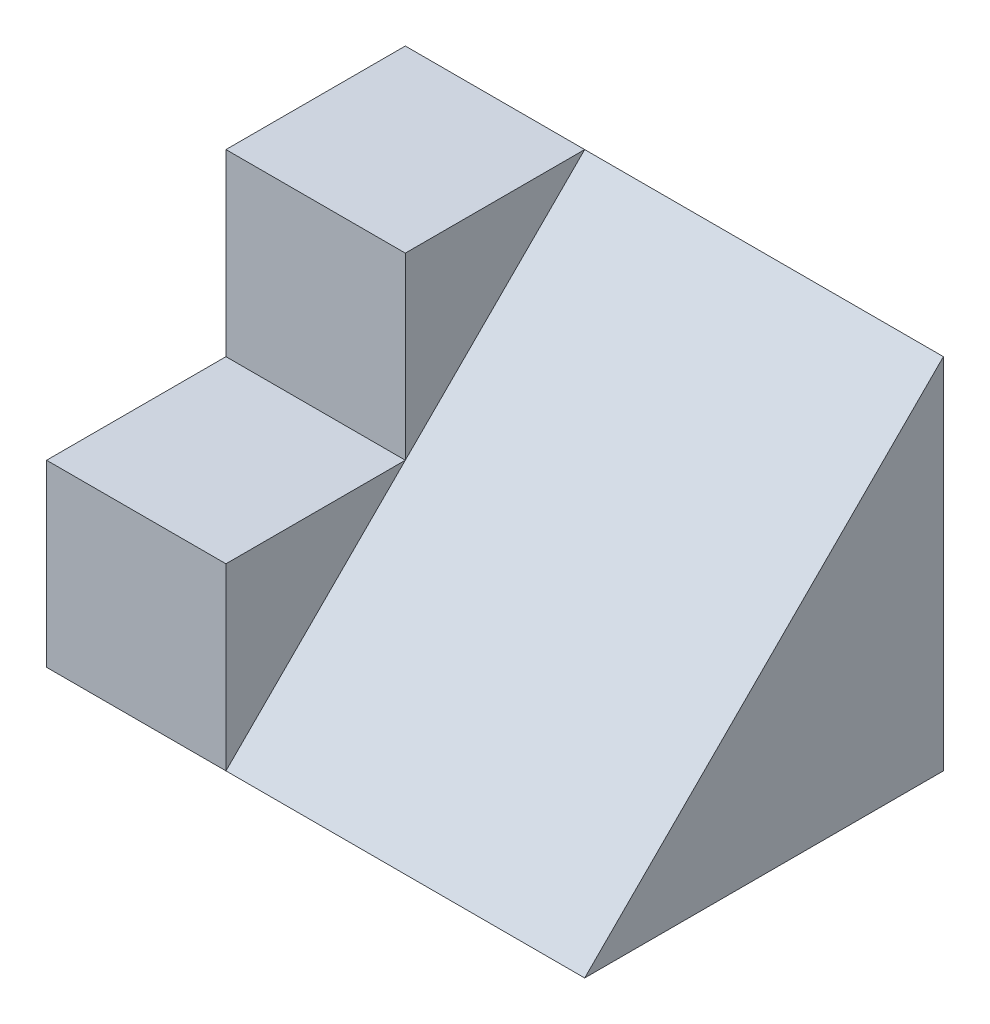
ISO-10303-21;
HEADER;
FILE_DESCRIPTION(('STEP AP214'),'2;1');
FILE_NAME('part.step','',(''),(''),'','','');
FILE_SCHEMA(('AUTOMOTIVE_DESIGN { 1 0 10303 214 1 1 1 1 }'));
ENDSEC;
DATA;
#1=APPLICATION_CONTEXT('core data for automotive mechanical design processes');
#2=APPLICATION_PROTOCOL_DEFINITION('international standard','automotive_design',2000,#1);
#3=PRODUCT_CONTEXT('',#1,'mechanical');
#4=PRODUCT('Part','Part','',(#3));
#5=PRODUCT_RELATED_PRODUCT_CATEGORY('part','',(#4));
#6=PRODUCT_DEFINITION_FORMATION('','',#4);
#7=PRODUCT_DEFINITION_CONTEXT('part definition',#1,'design');
#8=PRODUCT_DEFINITION('design','',#6,#7);
#9=PRODUCT_DEFINITION_SHAPE('','',#8);
#10=(LENGTH_UNIT() NAMED_UNIT(*) SI_UNIT(.MILLI.,.METRE.));
#11=(NAMED_UNIT(*) PLANE_ANGLE_UNIT() SI_UNIT($,.RADIAN.));
#12=(NAMED_UNIT(*) SI_UNIT($,.STERADIAN.) SOLID_ANGLE_UNIT());
#13=UNCERTAINTY_MEASURE_WITH_UNIT(LENGTH_MEASURE(1.E-05),#10,'distance_accuracy_value','');
#14=(GEOMETRIC_REPRESENTATION_CONTEXT(3) GLOBAL_UNCERTAINTY_ASSIGNED_CONTEXT((#13)) GLOBAL_UNIT_ASSIGNED_CONTEXT((#10,
#11,#12)) REPRESENTATION_CONTEXT('',''));
#15=CARTESIAN_POINT('',(0.,0.,0.));
#16=DIRECTION('',(0.,0.,1.));
#17=DIRECTION('',(1.,0.,0.));
#18=AXIS2_PLACEMENT_3D('',#15,#16,#17);
#19=CARTESIAN_POINT('',(-76.2,50.8,50.8));
#20=DIRECTION('',(0.,-1.,0.));
#21=DIRECTION('',(0.,0.,-1.));
#22=AXIS2_PLACEMENT_3D('',#19,#20,#21);
#23=PLANE('',#22);
#24=DIRECTION('',(0.,0.,1.));
#25=VECTOR('',#24,1.);
#26=CARTESIAN_POINT('',(-25.4,50.8,-50.8));
#27=LINE('',#26,#25);
#28=CARTESIAN_POINT('',(-25.4,50.8,-50.8));
#29=VERTEX_POINT('',#28);
#30=CARTESIAN_POINT('',(-25.4,50.8,0.));
#31=VERTEX_POINT('',#30);
#32=EDGE_CURVE('E138',#29,#31,#27,.T.);
#33=ORIENTED_EDGE('',*,*,#32,.F.);
#34=DIRECTION('',(-1.,0.,0.));
#35=VECTOR('',#34,1.);
#36=CARTESIAN_POINT('',(-76.2,50.8,-50.8));
#37=LINE('',#36,#35);
#38=CARTESIAN_POINT('',(-76.2,50.8,-50.8));
#39=VERTEX_POINT('',#38);
#40=EDGE_CURVE('E125',#29,#39,#37,.T.);
#41=ORIENTED_EDGE('',*,*,#40,.T.);
#42=DIRECTION('',(0.,0.,-1.));
#43=VECTOR('',#42,1.);
#44=CARTESIAN_POINT('',(-76.2,50.8,50.8));
#45=LINE('',#44,#43);
#46=CARTESIAN_POINT('',(-76.2,50.8,0.));
#47=VERTEX_POINT('',#46);
#48=EDGE_CURVE('E11',#47,#39,#45,.T.);
#49=ORIENTED_EDGE('',*,*,#48,.F.);
#50=DIRECTION('',(-1.,0.,0.));
#51=VECTOR('',#50,1.);
#52=CARTESIAN_POINT('',(-76.2,50.8,0.));
#53=LINE('',#52,#51);
#54=EDGE_CURVE('E166',#31,#47,#53,.T.);
#55=ORIENTED_EDGE('',*,*,#54,.F.);
#56=EDGE_LOOP('',(#33,#41,#49,#55));
#57=FACE_BOUND('',#56,.T.);
#58=ADVANCED_FACE('F44',(#57),#23,.F.);
#59=CARTESIAN_POINT('',(0.,0.,50.8));
#60=DIRECTION('',(0.,0.,-1.));
#61=DIRECTION('',(-1.,0.,0.));
#62=AXIS2_PLACEMENT_3D('',#59,#60,#61);
#63=PLANE('',#62);
#64=DIRECTION('',(0.,-1.,0.));
#65=VECTOR('',#64,1.);
#66=CARTESIAN_POINT('',(-25.4,50.8,50.8));
#67=LINE('',#66,#65);
#68=CARTESIAN_POINT('',(-25.4,0.,50.8));
#69=VERTEX_POINT('',#68);
#70=CARTESIAN_POINT('',(-25.4,-50.8,50.8));
#71=VERTEX_POINT('',#70);
#72=EDGE_CURVE('E190',#69,#71,#67,.T.);
#73=ORIENTED_EDGE('',*,*,#72,.F.);
#74=DIRECTION('',(1.,0.,0.));
#75=VECTOR('',#74,1.);
#76=CARTESIAN_POINT('',(-76.2,0.,50.8));
#77=LINE('',#76,#75);
#78=CARTESIAN_POINT('',(-76.2,0.,50.8));
#79=VERTEX_POINT('',#78);
#80=EDGE_CURVE('E176',#79,#69,#77,.T.);
#81=ORIENTED_EDGE('',*,*,#80,.F.);
#82=DIRECTION('',(0.,-1.,0.));
#83=VECTOR('',#82,1.);
#84=CARTESIAN_POINT('',(-76.2,-50.8,50.8));
#85=LINE('',#84,#83);
#86=CARTESIAN_POINT('',(-76.2,-50.8,50.8));
#87=VERTEX_POINT('',#86);
#88=EDGE_CURVE('E68',#79,#87,#85,.T.);
#89=ORIENTED_EDGE('',*,*,#88,.T.);
#90=DIRECTION('',(1.,0.,0.));
#91=VECTOR('',#90,1.);
#92=CARTESIAN_POINT('',(-76.2,-50.8,50.8));
#93=LINE('',#92,#91);
#94=EDGE_CURVE('E101',#87,#71,#93,.T.);
#95=ORIENTED_EDGE('',*,*,#94,.T.);
#96=EDGE_LOOP('',(#73,#81,#89,#95));
#97=FACE_BOUND('',#96,.T.);
#98=ADVANCED_FACE('F205',(#97),#63,.F.);
#99=CARTESIAN_POINT('',(76.2,-50.8,50.8));
#100=DIRECTION('',(-1.,0.,0.));
#101=DIRECTION('',(0.,0.,1.));
#102=AXIS2_PLACEMENT_3D('',#99,#100,#101);
#103=PLANE('',#102);
#104=DIRECTION('',(0.,1.,0.));
#105=VECTOR('',#104,1.);
#106=CARTESIAN_POINT('',(76.2,-50.8,-50.8));
#107=LINE('',#106,#105);
#108=CARTESIAN_POINT('',(76.2,-50.8,-50.8));
#109=VERTEX_POINT('',#108);
#110=CARTESIAN_POINT('',(76.2,50.8,-50.8));
#111=VERTEX_POINT('',#110);
#112=EDGE_CURVE('E108',#109,#111,#107,.T.);
#113=ORIENTED_EDGE('',*,*,#112,.T.);
#114=DIRECTION('',(0.,0.707106781186547,-0.707106781186547));
#115=VECTOR('',#114,1.);
#116=CARTESIAN_POINT('',(76.2,-50.8,50.8));
#117=LINE('',#116,#115);
#118=CARTESIAN_POINT('',(76.2,-50.8,50.8));
#119=VERTEX_POINT('',#118);
#120=EDGE_CURVE('E191',#119,#111,#117,.T.);
#121=ORIENTED_EDGE('',*,*,#120,.F.);
#122=DIRECTION('',(0.,0.,-1.));
#123=VECTOR('',#122,1.);
#124=CARTESIAN_POINT('',(76.2,-50.8,50.8));
#125=LINE('',#124,#123);
#126=EDGE_CURVE('E103',#119,#109,#125,.T.);
#127=ORIENTED_EDGE('',*,*,#126,.T.);
#128=EDGE_LOOP('',(#113,#121,#127));
#129=FACE_BOUND('',#128,.T.);
#130=ADVANCED_FACE('F46',(#129),#103,.F.);
#131=CARTESIAN_POINT('',(-76.2,-50.8,50.8));
#132=DIRECTION('',(1.,0.,0.));
#133=DIRECTION('',(0.,0.,-1.));
#134=AXIS2_PLACEMENT_3D('',#131,#132,#133);
#135=PLANE('',#134);
#136=DIRECTION('',(0.,0.,1.));
#137=VECTOR('',#136,1.);
#138=CARTESIAN_POINT('',(-76.2,0.,50.8));
#139=LINE('',#138,#137);
#140=CARTESIAN_POINT('',(-76.2,0.,0.));
#141=VERTEX_POINT('',#140);
#142=EDGE_CURVE('E60',#141,#79,#139,.T.);
#143=ORIENTED_EDGE('',*,*,#142,.F.);
#144=DIRECTION('',(0.,1.,0.));
#145=VECTOR('',#144,1.);
#146=CARTESIAN_POINT('',(-76.2,0.,0.));
#147=LINE('',#146,#145);
#148=EDGE_CURVE('E126',#141,#47,#147,.T.);
#149=ORIENTED_EDGE('',*,*,#148,.T.);
#150=ORIENTED_EDGE('',*,*,#48,.T.);
#151=DIRECTION('',(0.,-1.,0.));
#152=VECTOR('',#151,1.);
#153=CARTESIAN_POINT('',(-76.2,-50.8,-50.8));
#154=LINE('',#153,#152);
#155=CARTESIAN_POINT('',(-76.2,-50.8,-50.8));
#156=VERTEX_POINT('',#155);
#157=EDGE_CURVE('E83',#39,#156,#154,.T.);
#158=ORIENTED_EDGE('',*,*,#157,.T.);
#159=DIRECTION('',(0.,0.,-1.));
#160=VECTOR('',#159,1.);
#161=CARTESIAN_POINT('',(-76.2,-50.8,50.8));
#162=LINE('',#161,#160);
#163=EDGE_CURVE('E53',#87,#156,#162,.T.);
#164=ORIENTED_EDGE('',*,*,#163,.F.);
#165=ORIENTED_EDGE('',*,*,#88,.F.);
#166=EDGE_LOOP('',(#143,#149,#150,#158,#164,#165));
#167=FACE_BOUND('',#166,.T.);
#168=ADVANCED_FACE('F85',(#167),#135,.F.);
#169=CARTESIAN_POINT('',(-76.2,-50.8,50.8));
#170=DIRECTION('',(0.,1.,0.));
#171=DIRECTION('',(0.,0.,1.));
#172=AXIS2_PLACEMENT_3D('',#169,#170,#171);
#173=PLANE('',#172);
#174=DIRECTION('',(1.,0.,0.));
#175=VECTOR('',#174,1.);
#176=CARTESIAN_POINT('',(-76.2,-50.8,-50.8));
#177=LINE('',#176,#175);
#178=EDGE_CURVE('E93',#156,#109,#177,.T.);
#179=ORIENTED_EDGE('',*,*,#178,.T.);
#180=ORIENTED_EDGE('',*,*,#126,.F.);
#181=DIRECTION('',(1.,0.,0.));
#182=VECTOR('',#181,1.);
#183=CARTESIAN_POINT('',(-25.4,-50.8,50.8));
#184=LINE('',#183,#182);
#185=EDGE_CURVE('E181',#71,#119,#184,.T.);
#186=ORIENTED_EDGE('',*,*,#185,.F.);
#187=ORIENTED_EDGE('',*,*,#94,.F.);
#188=ORIENTED_EDGE('',*,*,#163,.T.);
#189=EDGE_LOOP('',(#179,#180,#186,#187,#188));
#190=FACE_BOUND('',#189,.T.);
#191=ADVANCED_FACE('F97',(#190),#173,.F.);
#192=CARTESIAN_POINT('',(0.,0.,-50.8));
#193=DIRECTION('',(0.,0.,-1.));
#194=DIRECTION('',(-1.,0.,0.));
#195=AXIS2_PLACEMENT_3D('',#192,#193,#194);
#196=PLANE('',#195);
#197=ORIENTED_EDGE('',*,*,#112,.F.);
#198=ORIENTED_EDGE('',*,*,#178,.F.);
#199=ORIENTED_EDGE('',*,*,#157,.F.);
#200=ORIENTED_EDGE('',*,*,#40,.F.);
#201=EDGE_CURVE('E94',#111,#29,#37,.T.);
#202=ORIENTED_EDGE('',*,*,#201,.F.);
#203=EDGE_LOOP('',(#197,#198,#199,#200,#202));
#204=FACE_BOUND('',#203,.T.);
#205=ADVANCED_FACE('F105',(#204),#196,.T.);
#206=CARTESIAN_POINT('',(-76.2,0.,0.));
#207=DIRECTION('',(0.,0.,-1.));
#208=DIRECTION('',(-1.,0.,0.));
#209=AXIS2_PLACEMENT_3D('',#206,#207,#208);
#210=PLANE('',#209);
#211=ORIENTED_EDGE('',*,*,#54,.T.);
#212=ORIENTED_EDGE('',*,*,#148,.F.);
#213=DIRECTION('',(-1.,0.,0.));
#214=VECTOR('',#213,1.);
#215=CARTESIAN_POINT('',(-76.2,0.,0.));
#216=LINE('',#215,#214);
#217=CARTESIAN_POINT('',(-25.4,0.,0.));
#218=VERTEX_POINT('',#217);
#219=EDGE_CURVE('E165',#218,#141,#216,.T.);
#220=ORIENTED_EDGE('',*,*,#219,.F.);
#221=DIRECTION('',(0.,1.,0.));
#222=VECTOR('',#221,1.);
#223=CARTESIAN_POINT('',(-25.4,0.,0.));
#224=LINE('',#223,#222);
#225=EDGE_CURVE('E168',#218,#31,#224,.T.);
#226=ORIENTED_EDGE('',*,*,#225,.T.);
#227=EDGE_LOOP('',(#211,#212,#220,#226));
#228=FACE_BOUND('',#227,.T.);
#229=ADVANCED_FACE('F163',(#228),#210,.F.);
#230=CARTESIAN_POINT('',(0.,0.,0.));
#231=DIRECTION('',(0.,-1.,0.));
#232=DIRECTION('',(0.,0.,-1.));
#233=AXIS2_PLACEMENT_3D('',#230,#231,#232);
#234=PLANE('',#233);
#235=ORIENTED_EDGE('',*,*,#142,.T.);
#236=ORIENTED_EDGE('',*,*,#80,.T.);
#237=DIRECTION('',(0.,0.,-1.));
#238=VECTOR('',#237,1.);
#239=CARTESIAN_POINT('',(-25.4,0.,50.8));
#240=LINE('',#239,#238);
#241=EDGE_CURVE('E172',#69,#218,#240,.T.);
#242=ORIENTED_EDGE('',*,*,#241,.T.);
#243=ORIENTED_EDGE('',*,*,#219,.T.);
#244=EDGE_LOOP('',(#235,#236,#242,#243));
#245=FACE_BOUND('',#244,.T.);
#246=ADVANCED_FACE('F171',(#245),#234,.F.);
#247=CARTESIAN_POINT('',(-25.4,0.,0.));
#248=DIRECTION('',(1.,0.,0.));
#249=DIRECTION('',(0.,0.,-1.));
#250=AXIS2_PLACEMENT_3D('',#247,#248,#249);
#251=PLANE('',#250);
#252=ORIENTED_EDGE('',*,*,#225,.F.);
#253=DIRECTION('',(0.,0.707106781186547,-0.707106781186547));
#254=VECTOR('',#253,1.);
#255=CARTESIAN_POINT('',(-25.4,-50.8,50.8));
#256=LINE('',#255,#254);
#257=EDGE_CURVE('E145',#218,#29,#256,.T.);
#258=ORIENTED_EDGE('',*,*,#257,.T.);
#259=ORIENTED_EDGE('',*,*,#32,.T.);
#260=EDGE_LOOP('',(#252,#258,#259));
#261=FACE_BOUND('',#260,.T.);
#262=ADVANCED_FACE('F188',(#261),#251,.T.);
#263=ORIENTED_EDGE('',*,*,#241,.F.);
#264=ORIENTED_EDGE('',*,*,#72,.T.);
#265=EDGE_CURVE('E197',#71,#218,#256,.T.);
#266=ORIENTED_EDGE('',*,*,#265,.T.);
#267=EDGE_LOOP('',(#263,#264,#266));
#268=FACE_BOUND('',#267,.T.);
#269=ADVANCED_FACE('F226',(#268),#251,.T.);
#270=CARTESIAN_POINT('',(-25.4,-50.8,50.8));
#271=DIRECTION('',(0.,-0.707106781186548,-0.707106781186548));
#272=DIRECTION('',(0.,0.707106781186548,-0.707106781186548));
#273=AXIS2_PLACEMENT_3D('',#270,#271,#272);
#274=PLANE('',#273);
#275=ORIENTED_EDGE('',*,*,#120,.T.);
#276=ORIENTED_EDGE('',*,*,#201,.T.);
#277=ORIENTED_EDGE('',*,*,#257,.F.);
#278=ORIENTED_EDGE('',*,*,#265,.F.);
#279=ORIENTED_EDGE('',*,*,#185,.T.);
#280=EDGE_LOOP('',(#275,#276,#277,#278,#279));
#281=FACE_BOUND('',#280,.T.);
#282=ADVANCED_FACE('F203',(#281),#274,.F.);
#283=CLOSED_SHELL('',(#58,#98,#130,#168,#191,#205,#229,#246,#262,#269,#282));
#284=MANIFOLD_SOLID_BREP('B2',#283);
#285=ADVANCED_BREP_SHAPE_REPRESENTATION('',(#18,#284),#14);
#286=SHAPE_DEFINITION_REPRESENTATION(#9,#285);
ENDSEC;
END-ISO-10303-21;
